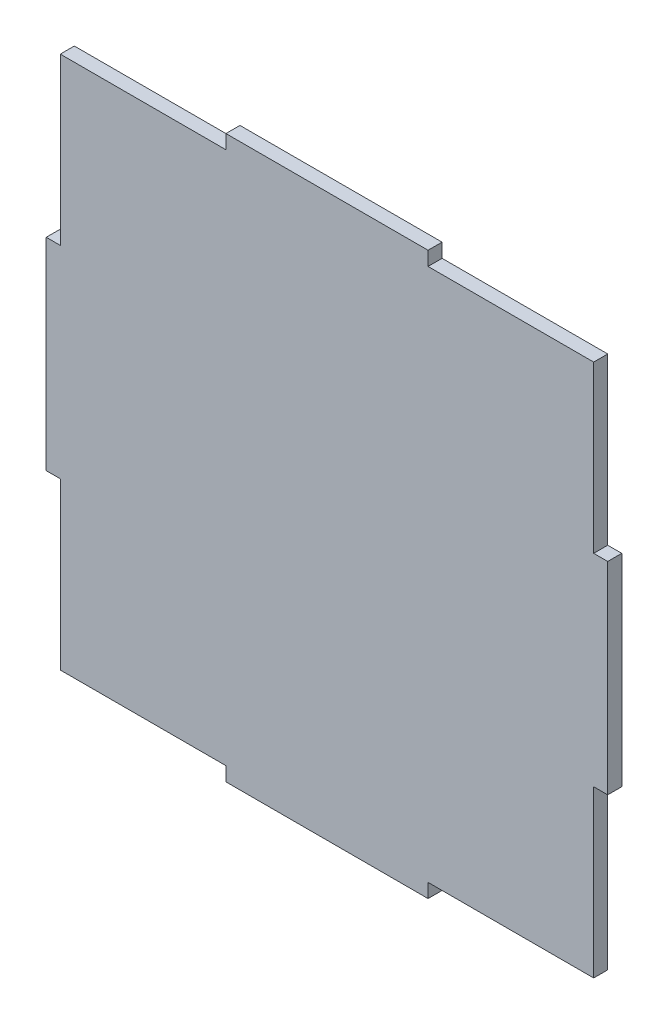
ISO-10303-21;
HEADER;
FILE_DESCRIPTION(('STEP AP214'),'2;1');
FILE_NAME('part.step','',(''),(''),'','','');
FILE_SCHEMA(('AUTOMOTIVE_DESIGN { 1 0 10303 214 1 1 1 1 }'));
ENDSEC;
DATA;
#1=APPLICATION_CONTEXT('core data for automotive mechanical design processes');
#2=APPLICATION_PROTOCOL_DEFINITION('international standard','automotive_design',2000,#1);
#3=PRODUCT_CONTEXT('',#1,'mechanical');
#4=PRODUCT('Part','Part','',(#3));
#5=PRODUCT_RELATED_PRODUCT_CATEGORY('part','',(#4));
#6=PRODUCT_DEFINITION_FORMATION('','',#4);
#7=PRODUCT_DEFINITION_CONTEXT('part definition',#1,'design');
#8=PRODUCT_DEFINITION('design','',#6,#7);
#9=PRODUCT_DEFINITION_SHAPE('','',#8);
#10=(LENGTH_UNIT() NAMED_UNIT(*) SI_UNIT(.MILLI.,.METRE.));
#11=(NAMED_UNIT(*) PLANE_ANGLE_UNIT() SI_UNIT($,.RADIAN.));
#12=(NAMED_UNIT(*) SI_UNIT($,.STERADIAN.) SOLID_ANGLE_UNIT());
#13=UNCERTAINTY_MEASURE_WITH_UNIT(LENGTH_MEASURE(1.E-05),#10,'distance_accuracy_value','');
#14=(GEOMETRIC_REPRESENTATION_CONTEXT(3) GLOBAL_UNCERTAINTY_ASSIGNED_CONTEXT((#13)) GLOBAL_UNIT_ASSIGNED_CONTEXT((#10,
#11,#12)) REPRESENTATION_CONTEXT('',''));
#15=CARTESIAN_POINT('',(0.,0.,0.));
#16=DIRECTION('',(0.,0.,1.));
#17=DIRECTION('',(1.,0.,0.));
#18=AXIS2_PLACEMENT_3D('',#15,#16,#17);
#19=CARTESIAN_POINT('',(-95.,36.,5.));
#20=DIRECTION('',(0.,-1.,0.));
#21=DIRECTION('',(0.,0.,-1.));
#22=AXIS2_PLACEMENT_3D('',#19,#20,#21);
#23=PLANE('',#22);
#24=DIRECTION('',(-1.,0.,0.));
#25=VECTOR('',#24,1.);
#26=CARTESIAN_POINT('',(-95.,36.,0.));
#27=LINE('',#26,#25);
#28=CARTESIAN_POINT('',(-95.,36.,0.));
#29=VERTEX_POINT('',#28);
#30=CARTESIAN_POINT('',(-100.,36.,0.));
#31=VERTEX_POINT('',#30);
#32=EDGE_CURVE('E207',#29,#31,#27,.T.);
#33=ORIENTED_EDGE('',*,*,#32,.T.);
#34=DIRECTION('',(0.,0.,-1.));
#35=VECTOR('',#34,1.);
#36=CARTESIAN_POINT('',(-100.,36.,5.));
#37=LINE('',#36,#35);
#38=CARTESIAN_POINT('',(-100.,36.,5.));
#39=VERTEX_POINT('',#38);
#40=EDGE_CURVE('E11',#39,#31,#37,.T.);
#41=ORIENTED_EDGE('',*,*,#40,.F.);
#42=DIRECTION('',(-1.,0.,0.));
#43=VECTOR('',#42,1.);
#44=CARTESIAN_POINT('',(-95.,36.,5.));
#45=LINE('',#44,#43);
#46=CARTESIAN_POINT('',(-95.,36.,5.));
#47=VERTEX_POINT('',#46);
#48=EDGE_CURVE('E245',#47,#39,#45,.T.);
#49=ORIENTED_EDGE('',*,*,#48,.F.);
#50=DIRECTION('',(0.,0.,-1.));
#51=VECTOR('',#50,1.);
#52=CARTESIAN_POINT('',(-95.,36.,5.));
#53=LINE('',#52,#51);
#54=EDGE_CURVE('E203',#47,#29,#53,.T.);
#55=ORIENTED_EDGE('',*,*,#54,.T.);
#56=EDGE_LOOP('',(#33,#41,#49,#55));
#57=FACE_BOUND('',#56,.T.);
#58=ADVANCED_FACE('F39',(#57),#23,.F.);
#59=CARTESIAN_POINT('',(-100.,36.,5.));
#60=DIRECTION('',(1.,0.,0.));
#61=DIRECTION('',(0.,1.,0.));
#62=AXIS2_PLACEMENT_3D('',#59,#60,#61);
#63=PLANE('',#62);
#64=DIRECTION('',(0.,-1.,0.));
#65=VECTOR('',#64,1.);
#66=CARTESIAN_POINT('',(-100.,36.,0.));
#67=LINE('',#66,#65);
#68=CARTESIAN_POINT('',(-100.,-36.,0.));
#69=VERTEX_POINT('',#68);
#70=EDGE_CURVE('E210',#31,#69,#67,.T.);
#71=ORIENTED_EDGE('',*,*,#70,.T.);
#72=DIRECTION('',(0.,0.,-1.));
#73=VECTOR('',#72,1.);
#74=CARTESIAN_POINT('',(-100.,-36.,5.));
#75=LINE('',#74,#73);
#76=CARTESIAN_POINT('',(-100.,-36.,5.));
#77=VERTEX_POINT('',#76);
#78=EDGE_CURVE('E47',#77,#69,#75,.T.);
#79=ORIENTED_EDGE('',*,*,#78,.F.);
#80=DIRECTION('',(0.,-1.,0.));
#81=VECTOR('',#80,1.);
#82=CARTESIAN_POINT('',(-100.,36.,5.));
#83=LINE('',#82,#81);
#84=EDGE_CURVE('E134',#39,#77,#83,.T.);
#85=ORIENTED_EDGE('',*,*,#84,.F.);
#86=ORIENTED_EDGE('',*,*,#40,.T.);
#87=EDGE_LOOP('',(#71,#79,#85,#86));
#88=FACE_BOUND('',#87,.T.);
#89=ADVANCED_FACE('F363',(#88),#63,.F.);
#90=CARTESIAN_POINT('',(-100.,-36.,5.));
#91=DIRECTION('',(0.,1.,0.));
#92=DIRECTION('',(0.,0.,1.));
#93=AXIS2_PLACEMENT_3D('',#90,#91,#92);
#94=PLANE('',#93);
#95=DIRECTION('',(1.,0.,0.));
#96=VECTOR('',#95,1.);
#97=CARTESIAN_POINT('',(-100.,-36.,0.));
#98=LINE('',#97,#96);
#99=CARTESIAN_POINT('',(-95.,-36.,0.));
#100=VERTEX_POINT('',#99);
#101=EDGE_CURVE('E212',#69,#100,#98,.T.);
#102=ORIENTED_EDGE('',*,*,#101,.T.);
#103=DIRECTION('',(0.,0.,-1.));
#104=VECTOR('',#103,1.);
#105=CARTESIAN_POINT('',(-95.,-36.,5.));
#106=LINE('',#105,#104);
#107=CARTESIAN_POINT('',(-95.,-36.,5.));
#108=VERTEX_POINT('',#107);
#109=EDGE_CURVE('E288',#108,#100,#106,.T.);
#110=ORIENTED_EDGE('',*,*,#109,.F.);
#111=DIRECTION('',(1.,0.,0.));
#112=VECTOR('',#111,1.);
#113=CARTESIAN_POINT('',(-100.,-36.,5.));
#114=LINE('',#113,#112);
#115=EDGE_CURVE('E296',#77,#108,#114,.T.);
#116=ORIENTED_EDGE('',*,*,#115,.F.);
#117=ORIENTED_EDGE('',*,*,#78,.T.);
#118=EDGE_LOOP('',(#102,#110,#116,#117));
#119=FACE_BOUND('',#118,.T.);
#120=ADVANCED_FACE('F294',(#119),#94,.F.);
#121=CARTESIAN_POINT('',(-95.,-36.,5.));
#122=DIRECTION('',(1.,0.,0.));
#123=DIRECTION('',(0.,1.,0.));
#124=AXIS2_PLACEMENT_3D('',#121,#122,#123);
#125=PLANE('',#124);
#126=DIRECTION('',(0.,-1.,0.));
#127=VECTOR('',#126,1.);
#128=CARTESIAN_POINT('',(-95.,-36.,0.));
#129=LINE('',#128,#127);
#130=CARTESIAN_POINT('',(-95.,-95.,0.));
#131=VERTEX_POINT('',#130);
#132=EDGE_CURVE('E214',#100,#131,#129,.T.);
#133=ORIENTED_EDGE('',*,*,#132,.T.);
#134=DIRECTION('',(0.,0.,-1.));
#135=VECTOR('',#134,1.);
#136=CARTESIAN_POINT('',(-95.,-95.,5.));
#137=LINE('',#136,#135);
#138=CARTESIAN_POINT('',(-95.,-95.,5.));
#139=VERTEX_POINT('',#138);
#140=EDGE_CURVE('E285',#139,#131,#137,.T.);
#141=ORIENTED_EDGE('',*,*,#140,.F.);
#142=DIRECTION('',(0.,-1.,0.));
#143=VECTOR('',#142,1.);
#144=CARTESIAN_POINT('',(-95.,-36.,5.));
#145=LINE('',#144,#143);
#146=EDGE_CURVE('E314',#108,#139,#145,.T.);
#147=ORIENTED_EDGE('',*,*,#146,.F.);
#148=ORIENTED_EDGE('',*,*,#109,.T.);
#149=EDGE_LOOP('',(#133,#141,#147,#148));
#150=FACE_BOUND('',#149,.T.);
#151=ADVANCED_FACE('F305',(#150),#125,.F.);
#152=CARTESIAN_POINT('',(-95.,-95.,5.));
#153=DIRECTION('',(0.,1.,0.));
#154=DIRECTION('',(0.,0.,1.));
#155=AXIS2_PLACEMENT_3D('',#152,#153,#154);
#156=PLANE('',#155);
#157=DIRECTION('',(1.,0.,0.));
#158=VECTOR('',#157,1.);
#159=CARTESIAN_POINT('',(-95.,-95.,0.));
#160=LINE('',#159,#158);
#161=CARTESIAN_POINT('',(-36.,-95.,0.));
#162=VERTEX_POINT('',#161);
#163=EDGE_CURVE('E216',#131,#162,#160,.T.);
#164=ORIENTED_EDGE('',*,*,#163,.T.);
#165=DIRECTION('',(0.,0.,-1.));
#166=VECTOR('',#165,1.);
#167=CARTESIAN_POINT('',(-36.,-95.,5.));
#168=LINE('',#167,#166);
#169=CARTESIAN_POINT('',(-36.,-95.,5.));
#170=VERTEX_POINT('',#169);
#171=EDGE_CURVE('E282',#170,#162,#168,.T.);
#172=ORIENTED_EDGE('',*,*,#171,.F.);
#173=DIRECTION('',(1.,0.,0.));
#174=VECTOR('',#173,1.);
#175=CARTESIAN_POINT('',(-95.,-95.,5.));
#176=LINE('',#175,#174);
#177=EDGE_CURVE('E311',#139,#170,#176,.T.);
#178=ORIENTED_EDGE('',*,*,#177,.F.);
#179=ORIENTED_EDGE('',*,*,#140,.T.);
#180=EDGE_LOOP('',(#164,#172,#178,#179));
#181=FACE_BOUND('',#180,.T.);
#182=ADVANCED_FACE('F309',(#181),#156,.F.);
#183=CARTESIAN_POINT('',(-36.,-95.,5.));
#184=DIRECTION('',(1.,0.,0.));
#185=DIRECTION('',(0.,0.,-1.));
#186=AXIS2_PLACEMENT_3D('',#183,#184,#185);
#187=PLANE('',#186);
#188=DIRECTION('',(0.,-1.,0.));
#189=VECTOR('',#188,1.);
#190=CARTESIAN_POINT('',(-36.,-95.,0.));
#191=LINE('',#190,#189);
#192=CARTESIAN_POINT('',(-36.,-100.,0.));
#193=VERTEX_POINT('',#192);
#194=EDGE_CURVE('E218',#162,#193,#191,.T.);
#195=ORIENTED_EDGE('',*,*,#194,.T.);
#196=DIRECTION('',(0.,0.,-1.));
#197=VECTOR('',#196,1.);
#198=CARTESIAN_POINT('',(-36.,-100.,5.));
#199=LINE('',#198,#197);
#200=CARTESIAN_POINT('',(-36.,-100.,5.));
#201=VERTEX_POINT('',#200);
#202=EDGE_CURVE('E279',#201,#193,#199,.T.);
#203=ORIENTED_EDGE('',*,*,#202,.F.);
#204=DIRECTION('',(0.,-1.,0.));
#205=VECTOR('',#204,1.);
#206=CARTESIAN_POINT('',(-36.,-95.,5.));
#207=LINE('',#206,#205);
#208=EDGE_CURVE('E313',#170,#201,#207,.T.);
#209=ORIENTED_EDGE('',*,*,#208,.F.);
#210=ORIENTED_EDGE('',*,*,#171,.T.);
#211=EDGE_LOOP('',(#195,#203,#209,#210));
#212=FACE_BOUND('',#211,.T.);
#213=ADVANCED_FACE('F376',(#212),#187,.F.);
#214=CARTESIAN_POINT('',(-36.,-100.,5.));
#215=DIRECTION('',(0.,1.,0.));
#216=DIRECTION('',(0.,0.,1.));
#217=AXIS2_PLACEMENT_3D('',#214,#215,#216);
#218=PLANE('',#217);
#219=DIRECTION('',(1.,0.,0.));
#220=VECTOR('',#219,1.);
#221=CARTESIAN_POINT('',(-36.,-100.,0.));
#222=LINE('',#221,#220);
#223=CARTESIAN_POINT('',(36.,-100.,0.));
#224=VERTEX_POINT('',#223);
#225=EDGE_CURVE('E220',#193,#224,#222,.T.);
#226=ORIENTED_EDGE('',*,*,#225,.T.);
#227=DIRECTION('',(0.,0.,-1.));
#228=VECTOR('',#227,1.);
#229=CARTESIAN_POINT('',(36.,-100.,5.));
#230=LINE('',#229,#228);
#231=CARTESIAN_POINT('',(36.,-100.,5.));
#232=VERTEX_POINT('',#231);
#233=EDGE_CURVE('E276',#232,#224,#230,.T.);
#234=ORIENTED_EDGE('',*,*,#233,.F.);
#235=DIRECTION('',(1.,0.,0.));
#236=VECTOR('',#235,1.);
#237=CARTESIAN_POINT('',(-36.,-100.,5.));
#238=LINE('',#237,#236);
#239=EDGE_CURVE('E316',#201,#232,#238,.T.);
#240=ORIENTED_EDGE('',*,*,#239,.F.);
#241=ORIENTED_EDGE('',*,*,#202,.T.);
#242=EDGE_LOOP('',(#226,#234,#240,#241));
#243=FACE_BOUND('',#242,.T.);
#244=ADVANCED_FACE('F379',(#243),#218,.F.);
#245=CARTESIAN_POINT('',(36.,-95.,5.));
#246=DIRECTION('',(-1.,0.,0.));
#247=DIRECTION('',(0.,0.,1.));
#248=AXIS2_PLACEMENT_3D('',#245,#246,#247);
#249=PLANE('',#248);
#250=DIRECTION('',(0.,1.,0.));
#251=VECTOR('',#250,1.);
#252=CARTESIAN_POINT('',(36.,-95.,0.));
#253=LINE('',#252,#251);
#254=CARTESIAN_POINT('',(36.,-95.,0.));
#255=VERTEX_POINT('',#254);
#256=EDGE_CURVE('E222',#224,#255,#253,.T.);
#257=ORIENTED_EDGE('',*,*,#256,.T.);
#258=DIRECTION('',(0.,0.,-1.));
#259=VECTOR('',#258,1.);
#260=CARTESIAN_POINT('',(36.,-95.,5.));
#261=LINE('',#260,#259);
#262=CARTESIAN_POINT('',(36.,-95.,5.));
#263=VERTEX_POINT('',#262);
#264=EDGE_CURVE('E273',#263,#255,#261,.T.);
#265=ORIENTED_EDGE('',*,*,#264,.F.);
#266=DIRECTION('',(0.,1.,0.));
#267=VECTOR('',#266,1.);
#268=CARTESIAN_POINT('',(36.,-95.,5.));
#269=LINE('',#268,#267);
#270=EDGE_CURVE('E322',#232,#263,#269,.T.);
#271=ORIENTED_EDGE('',*,*,#270,.F.);
#272=ORIENTED_EDGE('',*,*,#233,.T.);
#273=EDGE_LOOP('',(#257,#265,#271,#272));
#274=FACE_BOUND('',#273,.T.);
#275=ADVANCED_FACE('F383',(#274),#249,.F.);
#276=CARTESIAN_POINT('',(95.,-95.,5.));
#277=DIRECTION('',(0.,1.,0.));
#278=DIRECTION('',(0.,0.,1.));
#279=AXIS2_PLACEMENT_3D('',#276,#277,#278);
#280=PLANE('',#279);
#281=DIRECTION('',(1.,0.,0.));
#282=VECTOR('',#281,1.);
#283=CARTESIAN_POINT('',(95.,-95.,0.));
#284=LINE('',#283,#282);
#285=CARTESIAN_POINT('',(95.,-95.,0.));
#286=VERTEX_POINT('',#285);
#287=EDGE_CURVE('E224',#255,#286,#284,.T.);
#288=ORIENTED_EDGE('',*,*,#287,.T.);
#289=DIRECTION('',(0.,0.,-1.));
#290=VECTOR('',#289,1.);
#291=CARTESIAN_POINT('',(95.,-95.,5.));
#292=LINE('',#291,#290);
#293=CARTESIAN_POINT('',(95.,-95.,5.));
#294=VERTEX_POINT('',#293);
#295=EDGE_CURVE('E270',#294,#286,#292,.T.);
#296=ORIENTED_EDGE('',*,*,#295,.F.);
#297=DIRECTION('',(1.,0.,0.));
#298=VECTOR('',#297,1.);
#299=CARTESIAN_POINT('',(95.,-95.,5.));
#300=LINE('',#299,#298);
#301=EDGE_CURVE('E324',#263,#294,#300,.T.);
#302=ORIENTED_EDGE('',*,*,#301,.F.);
#303=ORIENTED_EDGE('',*,*,#264,.T.);
#304=EDGE_LOOP('',(#288,#296,#302,#303));
#305=FACE_BOUND('',#304,.T.);
#306=ADVANCED_FACE('F387',(#305),#280,.F.);
#307=CARTESIAN_POINT('',(95.,-36.,5.));
#308=DIRECTION('',(-1.,0.,0.));
#309=DIRECTION('',(0.,-1.,0.));
#310=AXIS2_PLACEMENT_3D('',#307,#308,#309);
#311=PLANE('',#310);
#312=DIRECTION('',(0.,1.,0.));
#313=VECTOR('',#312,1.);
#314=CARTESIAN_POINT('',(95.,-36.,0.));
#315=LINE('',#314,#313);
#316=CARTESIAN_POINT('',(95.,-36.,0.));
#317=VERTEX_POINT('',#316);
#318=EDGE_CURVE('E226',#286,#317,#315,.T.);
#319=ORIENTED_EDGE('',*,*,#318,.T.);
#320=DIRECTION('',(0.,0.,-1.));
#321=VECTOR('',#320,1.);
#322=CARTESIAN_POINT('',(95.,-36.,5.));
#323=LINE('',#322,#321);
#324=CARTESIAN_POINT('',(95.,-36.,5.));
#325=VERTEX_POINT('',#324);
#326=EDGE_CURVE('E267',#325,#317,#323,.T.);
#327=ORIENTED_EDGE('',*,*,#326,.F.);
#328=DIRECTION('',(0.,1.,0.));
#329=VECTOR('',#328,1.);
#330=CARTESIAN_POINT('',(95.,-36.,5.));
#331=LINE('',#330,#329);
#332=EDGE_CURVE('E326',#294,#325,#331,.T.);
#333=ORIENTED_EDGE('',*,*,#332,.F.);
#334=ORIENTED_EDGE('',*,*,#295,.T.);
#335=EDGE_LOOP('',(#319,#327,#333,#334));
#336=FACE_BOUND('',#335,.T.);
#337=ADVANCED_FACE('F391',(#336),#311,.F.);
#338=CARTESIAN_POINT('',(100.,-36.,5.));
#339=DIRECTION('',(0.,1.,0.));
#340=DIRECTION('',(-1.,0.,0.));
#341=AXIS2_PLACEMENT_3D('',#338,#339,#340);
#342=PLANE('',#341);
#343=DIRECTION('',(1.,0.,0.));
#344=VECTOR('',#343,1.);
#345=CARTESIAN_POINT('',(100.,-36.,0.));
#346=LINE('',#345,#344);
#347=CARTESIAN_POINT('',(100.,-36.,0.));
#348=VERTEX_POINT('',#347);
#349=EDGE_CURVE('E228',#317,#348,#346,.T.);
#350=ORIENTED_EDGE('',*,*,#349,.T.);
#351=DIRECTION('',(0.,0.,-1.));
#352=VECTOR('',#351,1.);
#353=CARTESIAN_POINT('',(100.,-36.,5.));
#354=LINE('',#353,#352);
#355=CARTESIAN_POINT('',(100.,-36.,5.));
#356=VERTEX_POINT('',#355);
#357=EDGE_CURVE('E264',#356,#348,#354,.T.);
#358=ORIENTED_EDGE('',*,*,#357,.F.);
#359=DIRECTION('',(1.,0.,0.));
#360=VECTOR('',#359,1.);
#361=CARTESIAN_POINT('',(100.,-36.,5.));
#362=LINE('',#361,#360);
#363=EDGE_CURVE('E328',#325,#356,#362,.T.);
#364=ORIENTED_EDGE('',*,*,#363,.F.);
#365=ORIENTED_EDGE('',*,*,#326,.T.);
#366=EDGE_LOOP('',(#350,#358,#364,#365));
#367=FACE_BOUND('',#366,.T.);
#368=ADVANCED_FACE('F395',(#367),#342,.F.);
#369=CARTESIAN_POINT('',(100.,36.,5.));
#370=DIRECTION('',(-1.,0.,0.));
#371=DIRECTION('',(0.,-1.,0.));
#372=AXIS2_PLACEMENT_3D('',#369,#370,#371);
#373=PLANE('',#372);
#374=DIRECTION('',(0.,1.,0.));
#375=VECTOR('',#374,1.);
#376=CARTESIAN_POINT('',(100.,36.,0.));
#377=LINE('',#376,#375);
#378=CARTESIAN_POINT('',(100.,36.,0.));
#379=VERTEX_POINT('',#378);
#380=EDGE_CURVE('E230',#348,#379,#377,.T.);
#381=ORIENTED_EDGE('',*,*,#380,.T.);
#382=DIRECTION('',(0.,0.,-1.));
#383=VECTOR('',#382,1.);
#384=CARTESIAN_POINT('',(100.,36.,5.));
#385=LINE('',#384,#383);
#386=CARTESIAN_POINT('',(100.,36.,5.));
#387=VERTEX_POINT('',#386);
#388=EDGE_CURVE('E261',#387,#379,#385,.T.);
#389=ORIENTED_EDGE('',*,*,#388,.F.);
#390=DIRECTION('',(0.,1.,0.));
#391=VECTOR('',#390,1.);
#392=CARTESIAN_POINT('',(100.,36.,5.));
#393=LINE('',#392,#391);
#394=EDGE_CURVE('E330',#356,#387,#393,.T.);
#395=ORIENTED_EDGE('',*,*,#394,.F.);
#396=ORIENTED_EDGE('',*,*,#357,.T.);
#397=EDGE_LOOP('',(#381,#389,#395,#396));
#398=FACE_BOUND('',#397,.T.);
#399=ADVANCED_FACE('F399',(#398),#373,.F.);
#400=CARTESIAN_POINT('',(95.,36.,5.));
#401=DIRECTION('',(0.,-1.,0.));
#402=DIRECTION('',(0.,0.,-1.));
#403=AXIS2_PLACEMENT_3D('',#400,#401,#402);
#404=PLANE('',#403);
#405=DIRECTION('',(-1.,0.,0.));
#406=VECTOR('',#405,1.);
#407=CARTESIAN_POINT('',(95.,36.,0.));
#408=LINE('',#407,#406);
#409=CARTESIAN_POINT('',(95.,36.,0.));
#410=VERTEX_POINT('',#409);
#411=EDGE_CURVE('E232',#379,#410,#408,.T.);
#412=ORIENTED_EDGE('',*,*,#411,.T.);
#413=DIRECTION('',(0.,0.,-1.));
#414=VECTOR('',#413,1.);
#415=CARTESIAN_POINT('',(95.,36.,5.));
#416=LINE('',#415,#414);
#417=CARTESIAN_POINT('',(95.,36.,5.));
#418=VERTEX_POINT('',#417);
#419=EDGE_CURVE('E258',#418,#410,#416,.T.);
#420=ORIENTED_EDGE('',*,*,#419,.F.);
#421=DIRECTION('',(-1.,0.,0.));
#422=VECTOR('',#421,1.);
#423=CARTESIAN_POINT('',(95.,36.,5.));
#424=LINE('',#423,#422);
#425=EDGE_CURVE('E332',#387,#418,#424,.T.);
#426=ORIENTED_EDGE('',*,*,#425,.F.);
#427=ORIENTED_EDGE('',*,*,#388,.T.);
#428=EDGE_LOOP('',(#412,#420,#426,#427));
#429=FACE_BOUND('',#428,.T.);
#430=ADVANCED_FACE('F403',(#429),#404,.F.);
#431=CARTESIAN_POINT('',(95.,95.,5.));
#432=DIRECTION('',(-1.,0.,0.));
#433=DIRECTION('',(0.,-1.,0.));
#434=AXIS2_PLACEMENT_3D('',#431,#432,#433);
#435=PLANE('',#434);
#436=DIRECTION('',(0.,1.,0.));
#437=VECTOR('',#436,1.);
#438=CARTESIAN_POINT('',(95.,95.,0.));
#439=LINE('',#438,#437);
#440=CARTESIAN_POINT('',(95.,95.,0.));
#441=VERTEX_POINT('',#440);
#442=EDGE_CURVE('E234',#410,#441,#439,.T.);
#443=ORIENTED_EDGE('',*,*,#442,.T.);
#444=DIRECTION('',(0.,0.,-1.));
#445=VECTOR('',#444,1.);
#446=CARTESIAN_POINT('',(95.,95.,5.));
#447=LINE('',#446,#445);
#448=CARTESIAN_POINT('',(95.,95.,5.));
#449=VERTEX_POINT('',#448);
#450=EDGE_CURVE('E255',#449,#441,#447,.T.);
#451=ORIENTED_EDGE('',*,*,#450,.F.);
#452=DIRECTION('',(0.,1.,0.));
#453=VECTOR('',#452,1.);
#454=CARTESIAN_POINT('',(95.,95.,5.));
#455=LINE('',#454,#453);
#456=EDGE_CURVE('E334',#418,#449,#455,.T.);
#457=ORIENTED_EDGE('',*,*,#456,.F.);
#458=ORIENTED_EDGE('',*,*,#419,.T.);
#459=EDGE_LOOP('',(#443,#451,#457,#458));
#460=FACE_BOUND('',#459,.T.);
#461=ADVANCED_FACE('F407',(#460),#435,.F.);
#462=CARTESIAN_POINT('',(36.,95.,5.));
#463=DIRECTION('',(0.,-1.,0.));
#464=DIRECTION('',(0.,0.,-1.));
#465=AXIS2_PLACEMENT_3D('',#462,#463,#464);
#466=PLANE('',#465);
#467=DIRECTION('',(-1.,0.,0.));
#468=VECTOR('',#467,1.);
#469=CARTESIAN_POINT('',(36.,95.,0.));
#470=LINE('',#469,#468);
#471=CARTESIAN_POINT('',(36.,95.,0.));
#472=VERTEX_POINT('',#471);
#473=EDGE_CURVE('E236',#441,#472,#470,.T.);
#474=ORIENTED_EDGE('',*,*,#473,.T.);
#475=DIRECTION('',(0.,0.,-1.));
#476=VECTOR('',#475,1.);
#477=CARTESIAN_POINT('',(36.,95.,5.));
#478=LINE('',#477,#476);
#479=CARTESIAN_POINT('',(36.,95.,5.));
#480=VERTEX_POINT('',#479);
#481=EDGE_CURVE('E252',#480,#472,#478,.T.);
#482=ORIENTED_EDGE('',*,*,#481,.F.);
#483=DIRECTION('',(-1.,0.,0.));
#484=VECTOR('',#483,1.);
#485=CARTESIAN_POINT('',(36.,95.,5.));
#486=LINE('',#485,#484);
#487=EDGE_CURVE('E336',#449,#480,#486,.T.);
#488=ORIENTED_EDGE('',*,*,#487,.F.);
#489=ORIENTED_EDGE('',*,*,#450,.T.);
#490=EDGE_LOOP('',(#474,#482,#488,#489));
#491=FACE_BOUND('',#490,.T.);
#492=ADVANCED_FACE('F411',(#491),#466,.F.);
#493=CARTESIAN_POINT('',(36.,100.,5.));
#494=DIRECTION('',(-1.,0.,0.));
#495=DIRECTION('',(0.,0.,1.));
#496=AXIS2_PLACEMENT_3D('',#493,#494,#495);
#497=PLANE('',#496);
#498=DIRECTION('',(0.,1.,0.));
#499=VECTOR('',#498,1.);
#500=CARTESIAN_POINT('',(36.,100.,0.));
#501=LINE('',#500,#499);
#502=CARTESIAN_POINT('',(36.,100.,0.));
#503=VERTEX_POINT('',#502);
#504=EDGE_CURVE('E238',#472,#503,#501,.T.);
#505=ORIENTED_EDGE('',*,*,#504,.T.);
#506=DIRECTION('',(0.,0.,-1.));
#507=VECTOR('',#506,1.);
#508=CARTESIAN_POINT('',(36.,100.,5.));
#509=LINE('',#508,#507);
#510=CARTESIAN_POINT('',(36.,100.,5.));
#511=VERTEX_POINT('',#510);
#512=EDGE_CURVE('E249',#511,#503,#509,.T.);
#513=ORIENTED_EDGE('',*,*,#512,.F.);
#514=DIRECTION('',(0.,1.,0.));
#515=VECTOR('',#514,1.);
#516=CARTESIAN_POINT('',(36.,100.,5.));
#517=LINE('',#516,#515);
#518=EDGE_CURVE('E338',#480,#511,#517,.T.);
#519=ORIENTED_EDGE('',*,*,#518,.F.);
#520=ORIENTED_EDGE('',*,*,#481,.T.);
#521=EDGE_LOOP('',(#505,#513,#519,#520));
#522=FACE_BOUND('',#521,.T.);
#523=ADVANCED_FACE('F344',(#522),#497,.F.);
#524=CARTESIAN_POINT('',(36.,100.,5.));
#525=DIRECTION('',(0.,-1.,0.));
#526=DIRECTION('',(0.,0.,-1.));
#527=AXIS2_PLACEMENT_3D('',#524,#525,#526);
#528=PLANE('',#527);
#529=DIRECTION('',(-1.,0.,0.));
#530=VECTOR('',#529,1.);
#531=CARTESIAN_POINT('',(36.,100.,0.));
#532=LINE('',#531,#530);
#533=CARTESIAN_POINT('',(-36.,100.,0.));
#534=VERTEX_POINT('',#533);
#535=EDGE_CURVE('E240',#503,#534,#532,.T.);
#536=ORIENTED_EDGE('',*,*,#535,.T.);
#537=DIRECTION('',(0.,0.,-1.));
#538=VECTOR('',#537,1.);
#539=CARTESIAN_POINT('',(-36.,100.,5.));
#540=LINE('',#539,#538);
#541=CARTESIAN_POINT('',(-36.,100.,5.));
#542=VERTEX_POINT('',#541);
#543=EDGE_CURVE('E198',#542,#534,#540,.T.);
#544=ORIENTED_EDGE('',*,*,#543,.F.);
#545=DIRECTION('',(-1.,0.,0.));
#546=VECTOR('',#545,1.);
#547=CARTESIAN_POINT('',(36.,100.,5.));
#548=LINE('',#547,#546);
#549=EDGE_CURVE('E189',#511,#542,#548,.T.);
#550=ORIENTED_EDGE('',*,*,#549,.F.);
#551=ORIENTED_EDGE('',*,*,#512,.T.);
#552=EDGE_LOOP('',(#536,#544,#550,#551));
#553=FACE_BOUND('',#552,.T.);
#554=ADVANCED_FACE('F348',(#553),#528,.F.);
#555=CARTESIAN_POINT('',(-36.,100.,5.));
#556=DIRECTION('',(1.,0.,0.));
#557=DIRECTION('',(0.,0.,-1.));
#558=AXIS2_PLACEMENT_3D('',#555,#556,#557);
#559=PLANE('',#558);
#560=DIRECTION('',(0.,-1.,0.));
#561=VECTOR('',#560,1.);
#562=CARTESIAN_POINT('',(-36.,100.,0.));
#563=LINE('',#562,#561);
#564=CARTESIAN_POINT('',(-36.,95.,0.));
#565=VERTEX_POINT('',#564);
#566=EDGE_CURVE('E197',#534,#565,#563,.T.);
#567=ORIENTED_EDGE('',*,*,#566,.T.);
#568=DIRECTION('',(0.,0.,-1.));
#569=VECTOR('',#568,1.);
#570=CARTESIAN_POINT('',(-36.,95.,5.));
#571=LINE('',#570,#569);
#572=CARTESIAN_POINT('',(-36.,95.,5.));
#573=VERTEX_POINT('',#572);
#574=EDGE_CURVE('E194',#573,#565,#571,.T.);
#575=ORIENTED_EDGE('',*,*,#574,.F.);
#576=DIRECTION('',(0.,-1.,0.));
#577=VECTOR('',#576,1.);
#578=CARTESIAN_POINT('',(-36.,100.,5.));
#579=LINE('',#578,#577);
#580=EDGE_CURVE('E183',#542,#573,#579,.T.);
#581=ORIENTED_EDGE('',*,*,#580,.F.);
#582=ORIENTED_EDGE('',*,*,#543,.T.);
#583=EDGE_LOOP('',(#567,#575,#581,#582));
#584=FACE_BOUND('',#583,.T.);
#585=ADVANCED_FACE('F195',(#584),#559,.F.);
#586=CARTESIAN_POINT('',(-36.,95.,5.));
#587=DIRECTION('',(0.,-1.,0.));
#588=DIRECTION('',(0.,0.,-1.));
#589=AXIS2_PLACEMENT_3D('',#586,#587,#588);
#590=PLANE('',#589);
#591=DIRECTION('',(-1.,0.,0.));
#592=VECTOR('',#591,1.);
#593=CARTESIAN_POINT('',(-36.,95.,0.));
#594=LINE('',#593,#592);
#595=CARTESIAN_POINT('',(-95.,95.,0.));
#596=VERTEX_POINT('',#595);
#597=EDGE_CURVE('E120',#565,#596,#594,.T.);
#598=ORIENTED_EDGE('',*,*,#597,.T.);
#599=DIRECTION('',(0.,0.,-1.));
#600=VECTOR('',#599,1.);
#601=CARTESIAN_POINT('',(-95.,95.,5.));
#602=LINE('',#601,#600);
#603=CARTESIAN_POINT('',(-95.,95.,5.));
#604=VERTEX_POINT('',#603);
#605=EDGE_CURVE('E199',#604,#596,#602,.T.);
#606=ORIENTED_EDGE('',*,*,#605,.F.);
#607=DIRECTION('',(-1.,0.,0.));
#608=VECTOR('',#607,1.);
#609=CARTESIAN_POINT('',(-36.,95.,5.));
#610=LINE('',#609,#608);
#611=EDGE_CURVE('E187',#573,#604,#610,.T.);
#612=ORIENTED_EDGE('',*,*,#611,.F.);
#613=ORIENTED_EDGE('',*,*,#574,.T.);
#614=EDGE_LOOP('',(#598,#606,#612,#613));
#615=FACE_BOUND('',#614,.T.);
#616=ADVANCED_FACE('F201',(#615),#590,.F.);
#617=CARTESIAN_POINT('',(-95.,95.,5.));
#618=DIRECTION('',(1.,0.,0.));
#619=DIRECTION('',(0.,0.,-1.));
#620=AXIS2_PLACEMENT_3D('',#617,#618,#619);
#621=PLANE('',#620);
#622=DIRECTION('',(0.,-1.,0.));
#623=VECTOR('',#622,1.);
#624=CARTESIAN_POINT('',(-95.,95.,0.));
#625=LINE('',#624,#623);
#626=EDGE_CURVE('E126',#596,#29,#625,.T.);
#627=ORIENTED_EDGE('',*,*,#626,.T.);
#628=ORIENTED_EDGE('',*,*,#54,.F.);
#629=DIRECTION('',(0.,-1.,0.));
#630=VECTOR('',#629,1.);
#631=CARTESIAN_POINT('',(-95.,95.,5.));
#632=LINE('',#631,#630);
#633=EDGE_CURVE('E55',#604,#47,#632,.T.);
#634=ORIENTED_EDGE('',*,*,#633,.F.);
#635=ORIENTED_EDGE('',*,*,#605,.T.);
#636=EDGE_LOOP('',(#627,#628,#634,#635));
#637=FACE_BOUND('',#636,.T.);
#638=ADVANCED_FACE('F352',(#637),#621,.F.);
#639=CARTESIAN_POINT('',(0.,0.,5.));
#640=DIRECTION('',(0.,0.,1.));
#641=DIRECTION('',(1.,0.,0.));
#642=AXIS2_PLACEMENT_3D('',#639,#640,#641);
#643=PLANE('',#642);
#644=ORIENTED_EDGE('',*,*,#48,.T.);
#645=ORIENTED_EDGE('',*,*,#84,.T.);
#646=ORIENTED_EDGE('',*,*,#115,.T.);
#647=ORIENTED_EDGE('',*,*,#146,.T.);
#648=ORIENTED_EDGE('',*,*,#177,.T.);
#649=ORIENTED_EDGE('',*,*,#208,.T.);
#650=ORIENTED_EDGE('',*,*,#239,.T.);
#651=ORIENTED_EDGE('',*,*,#270,.T.);
#652=ORIENTED_EDGE('',*,*,#301,.T.);
#653=ORIENTED_EDGE('',*,*,#332,.T.);
#654=ORIENTED_EDGE('',*,*,#363,.T.);
#655=ORIENTED_EDGE('',*,*,#394,.T.);
#656=ORIENTED_EDGE('',*,*,#425,.T.);
#657=ORIENTED_EDGE('',*,*,#456,.T.);
#658=ORIENTED_EDGE('',*,*,#487,.T.);
#659=ORIENTED_EDGE('',*,*,#518,.T.);
#660=ORIENTED_EDGE('',*,*,#549,.T.);
#661=ORIENTED_EDGE('',*,*,#580,.T.);
#662=ORIENTED_EDGE('',*,*,#611,.T.);
#663=ORIENTED_EDGE('',*,*,#633,.T.);
#664=EDGE_LOOP('',(#644,#645,#646,#647,#648,#649,#650,#651,#652,#653,#654,#655,#656,#657,#658,
#659,#660,#661,#662,#663));
#665=FACE_BOUND('',#664,.T.);
#666=ADVANCED_FACE('F185',(#665),#643,.T.);
#667=CARTESIAN_POINT('',(0.,0.,0.));
#668=DIRECTION('',(0.,0.,1.));
#669=DIRECTION('',(1.,0.,0.));
#670=AXIS2_PLACEMENT_3D('',#667,#668,#669);
#671=PLANE('',#670);
#672=ORIENTED_EDGE('',*,*,#32,.F.);
#673=ORIENTED_EDGE('',*,*,#626,.F.);
#674=ORIENTED_EDGE('',*,*,#597,.F.);
#675=ORIENTED_EDGE('',*,*,#566,.F.);
#676=ORIENTED_EDGE('',*,*,#535,.F.);
#677=ORIENTED_EDGE('',*,*,#504,.F.);
#678=ORIENTED_EDGE('',*,*,#473,.F.);
#679=ORIENTED_EDGE('',*,*,#442,.F.);
#680=ORIENTED_EDGE('',*,*,#411,.F.);
#681=ORIENTED_EDGE('',*,*,#380,.F.);
#682=ORIENTED_EDGE('',*,*,#349,.F.);
#683=ORIENTED_EDGE('',*,*,#318,.F.);
#684=ORIENTED_EDGE('',*,*,#287,.F.);
#685=ORIENTED_EDGE('',*,*,#256,.F.);
#686=ORIENTED_EDGE('',*,*,#225,.F.);
#687=ORIENTED_EDGE('',*,*,#194,.F.);
#688=ORIENTED_EDGE('',*,*,#163,.F.);
#689=ORIENTED_EDGE('',*,*,#132,.F.);
#690=ORIENTED_EDGE('',*,*,#101,.F.);
#691=ORIENTED_EDGE('',*,*,#70,.F.);
#692=EDGE_LOOP('',(#672,#673,#674,#675,#676,#677,#678,#679,#680,#681,#682,#683,#684,#685,#686,
#687,#688,#689,#690,#691));
#693=FACE_BOUND('',#692,.T.);
#694=ADVANCED_FACE('F300',(#693),#671,.F.);
#695=CLOSED_SHELL('',(#58,#89,#120,#151,#182,#213,#244,#275,#306,#337,#368,#399,#430,#461,#492,
#523,#554,#585,#616,#638,#666,#694));
#696=MANIFOLD_SOLID_BREP('B2',#695);
#697=ADVANCED_BREP_SHAPE_REPRESENTATION('',(#18,#696),#14);
#698=SHAPE_DEFINITION_REPRESENTATION(#9,#697);
ENDSEC;
END-ISO-10303-21;
